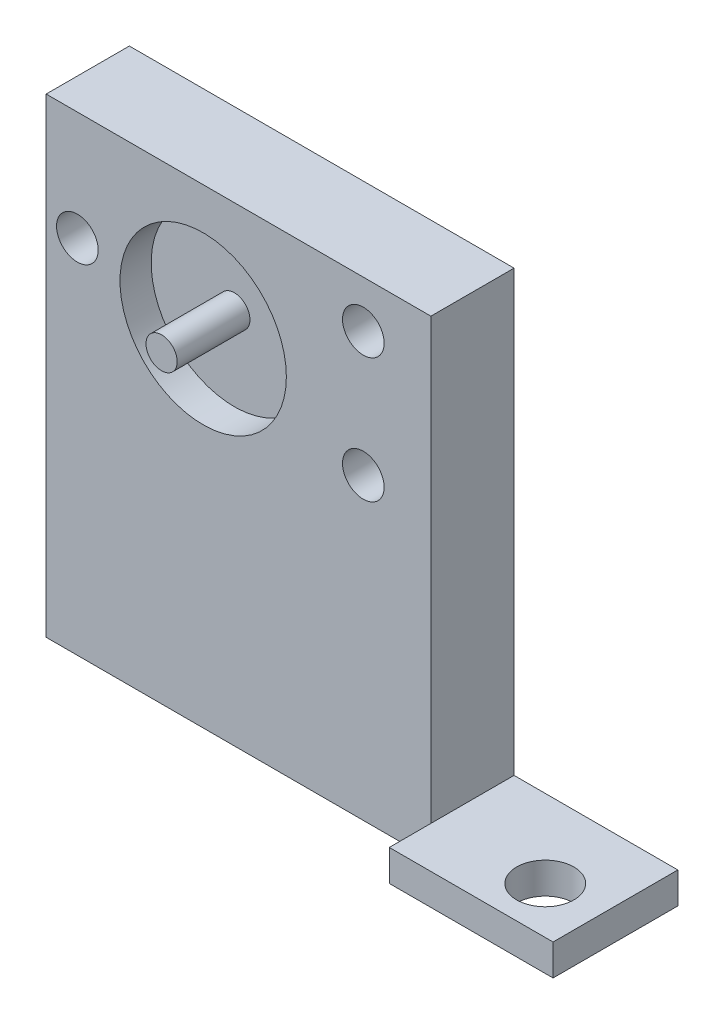
ISO-10303-21;
HEADER;
FILE_DESCRIPTION(('STEP AP214'),'2;1');
FILE_NAME('part.step','',(''),(''),'','','');
FILE_SCHEMA(('AUTOMOTIVE_DESIGN { 1 0 10303 214 1 1 1 1 }'));
ENDSEC;
DATA;
#1=APPLICATION_CONTEXT('core data for automotive mechanical design processes');
#2=APPLICATION_PROTOCOL_DEFINITION('international standard','automotive_design',2000,#1);
#3=PRODUCT_CONTEXT('',#1,'mechanical');
#4=PRODUCT('Part','Part','',(#3));
#5=PRODUCT_RELATED_PRODUCT_CATEGORY('part','',(#4));
#6=PRODUCT_DEFINITION_FORMATION('','',#4);
#7=PRODUCT_DEFINITION_CONTEXT('part definition',#1,'design');
#8=PRODUCT_DEFINITION('design','',#6,#7);
#9=PRODUCT_DEFINITION_SHAPE('','',#8);
#10=(LENGTH_UNIT() NAMED_UNIT(*) SI_UNIT(.MILLI.,.METRE.));
#11=(NAMED_UNIT(*) PLANE_ANGLE_UNIT() SI_UNIT($,.RADIAN.));
#12=(NAMED_UNIT(*) SI_UNIT($,.STERADIAN.) SOLID_ANGLE_UNIT());
#13=UNCERTAINTY_MEASURE_WITH_UNIT(LENGTH_MEASURE(1.E-05),#10,'distance_accuracy_value','');
#14=(GEOMETRIC_REPRESENTATION_CONTEXT(3) GLOBAL_UNCERTAINTY_ASSIGNED_CONTEXT((#13)) GLOBAL_UNIT_ASSIGNED_CONTEXT((#10,
#11,#12)) REPRESENTATION_CONTEXT('',''));
#15=CARTESIAN_POINT('',(0.,0.,0.));
#16=DIRECTION('',(0.,0.,1.));
#17=DIRECTION('',(1.,0.,0.));
#18=AXIS2_PLACEMENT_3D('',#15,#16,#17);
#19=CARTESIAN_POINT('',(0.,21.125,12.));
#20=DIRECTION('',(0.,-1.,0.));
#21=DIRECTION('',(1.,0.,0.));
#22=AXIS2_PLACEMENT_3D('',#19,#20,#21);
#23=PLANE('',#22);
#24=DIRECTION('',(-1.,0.,0.));
#25=VECTOR('',#24,1.);
#26=CARTESIAN_POINT('',(0.,21.125,0.));
#27=LINE('',#26,#25);
#28=CARTESIAN_POINT('',(55.5,21.125,0.));
#29=VERTEX_POINT('',#28);
#30=CARTESIAN_POINT('',(18.5,21.125,0.));
#31=VERTEX_POINT('',#30);
#32=EDGE_CURVE('E13',#29,#31,#27,.T.);
#33=ORIENTED_EDGE('',*,*,#32,.T.);
#34=DIRECTION('',(0.,0.,1.));
#35=VECTOR('',#34,1.);
#36=CARTESIAN_POINT('',(18.5,21.125,14.));
#37=LINE('',#36,#35);
#38=CARTESIAN_POINT('',(18.5,21.125,8.));
#39=VERTEX_POINT('',#38);
#40=EDGE_CURVE('E53',#31,#39,#37,.T.);
#41=ORIENTED_EDGE('',*,*,#40,.T.);
#42=DIRECTION('',(-1.,0.,0.));
#43=VECTOR('',#42,1.);
#44=CARTESIAN_POINT('',(0.,21.125,8.));
#45=LINE('',#44,#43);
#46=CARTESIAN_POINT('',(55.5,21.125,8.));
#47=VERTEX_POINT('',#46);
#48=EDGE_CURVE('E119',#47,#39,#45,.T.);
#49=ORIENTED_EDGE('',*,*,#48,.F.);
#50=DIRECTION('',(0.,0.,-1.));
#51=VECTOR('',#50,1.);
#52=CARTESIAN_POINT('',(55.5,21.125,12.));
#53=LINE('',#52,#51);
#54=EDGE_CURVE('E124',#47,#29,#53,.T.);
#55=ORIENTED_EDGE('',*,*,#54,.T.);
#56=EDGE_LOOP('',(#33,#41,#49,#55));
#57=FACE_BOUND('',#56,.T.);
#58=ADVANCED_FACE('F39',(#57),#23,.F.);
#59=CARTESIAN_POINT('',(0.,-24.125,0.));
#60=DIRECTION('',(0.,-1.,0.));
#61=DIRECTION('',(1.,0.,0.));
#62=AXIS2_PLACEMENT_3D('',#59,#60,#61);
#63=PLANE('',#62);
#64=DIRECTION('',(0.,0.,-1.));
#65=VECTOR('',#64,1.);
#66=CARTESIAN_POINT('',(18.5,-24.125,14.));
#67=LINE('',#66,#65);
#68=CARTESIAN_POINT('',(18.5,-24.125,8.));
#69=VERTEX_POINT('',#68);
#70=CARTESIAN_POINT('',(18.5,-24.125,0.));
#71=VERTEX_POINT('',#70);
#72=EDGE_CURVE('E100',#69,#71,#67,.T.);
#73=ORIENTED_EDGE('',*,*,#72,.T.);
#74=DIRECTION('',(1.,0.,0.));
#75=VECTOR('',#74,1.);
#76=CARTESIAN_POINT('',(0.,-24.125,0.));
#77=LINE('',#76,#75);
#78=CARTESIAN_POINT('',(71.25,-24.125,0.));
#79=VERTEX_POINT('',#78);
#80=EDGE_CURVE('E46',#71,#79,#77,.T.);
#81=ORIENTED_EDGE('',*,*,#80,.T.);
#82=DIRECTION('',(0.,0.,-1.));
#83=VECTOR('',#82,1.);
#84=CARTESIAN_POINT('',(71.25,-24.125,0.));
#85=LINE('',#84,#83);
#86=CARTESIAN_POINT('',(71.25,-24.125,12.));
#87=VERTEX_POINT('',#86);
#88=EDGE_CURVE('E155',#87,#79,#85,.T.);
#89=ORIENTED_EDGE('',*,*,#88,.F.);
#90=DIRECTION('',(1.,0.,0.));
#91=VECTOR('',#90,1.);
#92=CARTESIAN_POINT('',(37.,-24.125,12.));
#93=LINE('',#92,#91);
#94=CARTESIAN_POINT('',(55.5,-24.125,12.));
#95=VERTEX_POINT('',#94);
#96=EDGE_CURVE('E143',#95,#87,#93,.T.);
#97=ORIENTED_EDGE('',*,*,#96,.F.);
#98=DIRECTION('',(0.,0.,1.));
#99=VECTOR('',#98,1.);
#100=CARTESIAN_POINT('',(55.5,-24.125,8.));
#101=LINE('',#100,#99);
#102=CARTESIAN_POINT('',(55.5,-24.125,8.));
#103=VERTEX_POINT('',#102);
#104=EDGE_CURVE('E152',#103,#95,#101,.T.);
#105=ORIENTED_EDGE('',*,*,#104,.F.);
#106=DIRECTION('',(1.,0.,0.));
#107=VECTOR('',#106,1.);
#108=CARTESIAN_POINT('',(0.,-24.125,8.));
#109=LINE('',#108,#107);
#110=EDGE_CURVE('E113',#69,#103,#109,.T.);
#111=ORIENTED_EDGE('',*,*,#110,.F.);
#112=EDGE_LOOP('',(#73,#81,#89,#97,#105,#111));
#113=FACE_BOUND('',#112,.T.);
#114=CARTESIAN_POINT('',(66.,-24.125,7.5));
#115=DIRECTION('',(0.,1.,0.));
#116=DIRECTION('',(-1.,0.,0.));
#117=AXIS2_PLACEMENT_3D('',#114,#115,#116);
#118=CIRCLE('',#117,2.75);
#119=CARTESIAN_POINT('',(63.25,-24.125,7.5));
#120=VERTEX_POINT('',#119);
#121=EDGE_CURVE('E139',#120,#120,#118,.T.);
#122=ORIENTED_EDGE('',*,*,#121,.T.);
#123=EDGE_LOOP('',(#122));
#124=FACE_BOUND('',#123,.T.);
#125=ADVANCED_FACE('F108',(#113,#124),#63,.T.);
#126=CARTESIAN_POINT('',(55.5,0.,12.));
#127=DIRECTION('',(-1.,0.,0.));
#128=DIRECTION('',(0.,-1.,0.));
#129=AXIS2_PLACEMENT_3D('',#126,#127,#128);
#130=PLANE('',#129);
#131=DIRECTION('',(0.,-1.,0.));
#132=VECTOR('',#131,1.);
#133=CARTESIAN_POINT('',(55.5,0.,8.));
#134=LINE('',#133,#132);
#135=CARTESIAN_POINT('',(55.5,-21.125,8.));
#136=VERTEX_POINT('',#135);
#137=EDGE_CURVE('E159',#47,#136,#134,.T.);
#138=ORIENTED_EDGE('',*,*,#137,.T.);
#139=DIRECTION('',(0.,0.,-1.));
#140=VECTOR('',#139,1.);
#141=CARTESIAN_POINT('',(55.5,-21.125,12.));
#142=LINE('',#141,#140);
#143=CARTESIAN_POINT('',(55.5,-21.125,0.));
#144=VERTEX_POINT('',#143);
#145=EDGE_CURVE('E128',#136,#144,#142,.T.);
#146=ORIENTED_EDGE('',*,*,#145,.T.);
#147=DIRECTION('',(0.,1.,0.));
#148=VECTOR('',#147,1.);
#149=CARTESIAN_POINT('',(55.5,0.,0.));
#150=LINE('',#149,#148);
#151=EDGE_CURVE('E129',#144,#29,#150,.T.);
#152=ORIENTED_EDGE('',*,*,#151,.T.);
#153=ORIENTED_EDGE('',*,*,#54,.F.);
#154=EDGE_LOOP('',(#138,#146,#152,#153));
#155=FACE_BOUND('',#154,.T.);
#156=ADVANCED_FACE('F203',(#155),#130,.F.);
#157=CARTESIAN_POINT('',(37.,0.,12.));
#158=DIRECTION('',(0.,0.,1.));
#159=DIRECTION('',(-1.,0.,0.));
#160=AXIS2_PLACEMENT_3D('',#157,#158,#159);
#161=PLANE('',#160);
#162=DIRECTION('',(1.,0.,0.));
#163=VECTOR('',#162,1.);
#164=CARTESIAN_POINT('',(37.,-21.125,12.));
#165=LINE('',#164,#163);
#166=CARTESIAN_POINT('',(55.5,-21.125,12.));
#167=VERTEX_POINT('',#166);
#168=CARTESIAN_POINT('',(71.25,-21.125,12.));
#169=VERTEX_POINT('',#168);
#170=EDGE_CURVE('E150',#167,#169,#165,.T.);
#171=ORIENTED_EDGE('',*,*,#170,.F.);
#172=DIRECTION('',(0.,-1.,0.));
#173=VECTOR('',#172,1.);
#174=CARTESIAN_POINT('',(55.5,0.,12.));
#175=LINE('',#174,#173);
#176=EDGE_CURVE('E62',#167,#95,#175,.T.);
#177=ORIENTED_EDGE('',*,*,#176,.T.);
#178=ORIENTED_EDGE('',*,*,#96,.T.);
#179=DIRECTION('',(0.,1.,0.));
#180=VECTOR('',#179,1.);
#181=CARTESIAN_POINT('',(71.25,-24.125,12.));
#182=LINE('',#181,#180);
#183=EDGE_CURVE('E136',#87,#169,#182,.T.);
#184=ORIENTED_EDGE('',*,*,#183,.T.);
#185=EDGE_LOOP('',(#171,#177,#178,#184));
#186=FACE_BOUND('',#185,.T.);
#187=ADVANCED_FACE('F214',(#186),#161,.T.);
#188=CARTESIAN_POINT('',(0.,0.,8.));
#189=DIRECTION('',(0.,0.,1.));
#190=DIRECTION('',(1.,0.,0.));
#191=AXIS2_PLACEMENT_3D('',#188,#189,#190);
#192=PLANE('',#191);
#193=DIRECTION('',(0.,1.,0.));
#194=VECTOR('',#193,1.);
#195=CARTESIAN_POINT('',(18.5,0.,8.));
#196=LINE('',#195,#194);
#197=EDGE_CURVE('E178',#69,#39,#196,.T.);
#198=ORIENTED_EDGE('',*,*,#197,.F.);
#199=ORIENTED_EDGE('',*,*,#110,.T.);
#200=EDGE_CURVE('E161',#136,#103,#134,.T.);
#201=ORIENTED_EDGE('',*,*,#200,.F.);
#202=ORIENTED_EDGE('',*,*,#137,.F.);
#203=ORIENTED_EDGE('',*,*,#48,.T.);
#204=EDGE_LOOP('',(#198,#199,#201,#202,#203));
#205=FACE_BOUND('',#204,.T.);
#206=CARTESIAN_POINT('',(49.,16.625,8.));
#207=DIRECTION('',(0.,0.,-1.));
#208=DIRECTION('',(-1.,0.,0.));
#209=AXIS2_PLACEMENT_3D('',#206,#207,#208);
#210=CIRCLE('',#209,2.);
#211=CARTESIAN_POINT('',(47.,16.625,8.));
#212=VERTEX_POINT('',#211);
#213=EDGE_CURVE('E187',#212,#212,#210,.T.);
#214=ORIENTED_EDGE('',*,*,#213,.T.);
#215=EDGE_LOOP('',(#214));
#216=FACE_BOUND('',#215,.T.);
#217=CARTESIAN_POINT('',(49.,4.625,8.));
#218=DIRECTION('',(0.,0.,-1.));
#219=DIRECTION('',(-1.,0.,0.));
#220=AXIS2_PLACEMENT_3D('',#217,#218,#219);
#221=CIRCLE('',#220,2.);
#222=CARTESIAN_POINT('',(47.,4.625,8.));
#223=VERTEX_POINT('',#222);
#224=EDGE_CURVE('E181',#223,#223,#221,.T.);
#225=ORIENTED_EDGE('',*,*,#224,.T.);
#226=EDGE_LOOP('',(#225));
#227=FACE_BOUND('',#226,.T.);
#228=CARTESIAN_POINT('',(21.5,10.625,8.));
#229=DIRECTION('',(0.,0.,-1.));
#230=DIRECTION('',(-1.,0.,0.));
#231=AXIS2_PLACEMENT_3D('',#228,#229,#230);
#232=CIRCLE('',#231,2.);
#233=CARTESIAN_POINT('',(19.5,10.625,8.));
#234=VERTEX_POINT('',#233);
#235=EDGE_CURVE('E174',#234,#234,#232,.T.);
#236=ORIENTED_EDGE('',*,*,#235,.T.);
#237=EDGE_LOOP('',(#236));
#238=FACE_BOUND('',#237,.T.);
#239=CARTESIAN_POINT('',(33.6,9.125,8.));
#240=DIRECTION('',(0.,0.,1.));
#241=DIRECTION('',(1.,0.,0.));
#242=AXIS2_PLACEMENT_3D('',#239,#240,#241);
#243=CIRCLE('',#242,8.);
#244=CARTESIAN_POINT('',(41.6,9.125,8.));
#245=VERTEX_POINT('',#244);
#246=EDGE_CURVE('E162',#245,#245,#243,.F.);
#247=ORIENTED_EDGE('',*,*,#246,.T.);
#248=EDGE_LOOP('',(#247));
#249=FACE_BOUND('',#248,.T.);
#250=ADVANCED_FACE('F196',(#205,#216,#227,#238,#249),#192,.T.);
#251=CARTESIAN_POINT('',(0.,0.,0.));
#252=DIRECTION('',(0.,0.,1.));
#253=DIRECTION('',(1.,0.,0.));
#254=AXIS2_PLACEMENT_3D('',#251,#252,#253);
#255=PLANE('',#254);
#256=CARTESIAN_POINT('',(49.,16.625,0.));
#257=DIRECTION('',(0.,0.,-1.));
#258=DIRECTION('',(-1.,0.,0.));
#259=AXIS2_PLACEMENT_3D('',#256,#257,#258);
#260=CIRCLE('',#259,2.);
#261=CARTESIAN_POINT('',(47.,16.625,0.));
#262=VERTEX_POINT('',#261);
#263=EDGE_CURVE('E173',#262,#262,#260,.T.);
#264=ORIENTED_EDGE('',*,*,#263,.F.);
#265=EDGE_LOOP('',(#264));
#266=FACE_BOUND('',#265,.T.);
#267=CARTESIAN_POINT('',(49.,4.625,0.));
#268=DIRECTION('',(0.,0.,-1.));
#269=DIRECTION('',(-1.,0.,0.));
#270=AXIS2_PLACEMENT_3D('',#267,#268,#269);
#271=CIRCLE('',#270,2.);
#272=CARTESIAN_POINT('',(47.,4.625,0.));
#273=VERTEX_POINT('',#272);
#274=EDGE_CURVE('E184',#273,#273,#271,.T.);
#275=ORIENTED_EDGE('',*,*,#274,.F.);
#276=EDGE_LOOP('',(#275));
#277=FACE_BOUND('',#276,.T.);
#278=CARTESIAN_POINT('',(21.5,10.625,0.));
#279=DIRECTION('',(0.,0.,-1.));
#280=DIRECTION('',(-1.,0.,0.));
#281=AXIS2_PLACEMENT_3D('',#278,#279,#280);
#282=CIRCLE('',#281,2.);
#283=CARTESIAN_POINT('',(19.5,10.625,0.));
#284=VERTEX_POINT('',#283);
#285=EDGE_CURVE('E177',#284,#284,#282,.T.);
#286=ORIENTED_EDGE('',*,*,#285,.F.);
#287=EDGE_LOOP('',(#286));
#288=FACE_BOUND('',#287,.T.);
#289=ORIENTED_EDGE('',*,*,#80,.F.);
#290=DIRECTION('',(0.,1.,0.));
#291=VECTOR('',#290,1.);
#292=CARTESIAN_POINT('',(18.5,21.125,0.));
#293=LINE('',#292,#291);
#294=EDGE_CURVE('E97',#71,#31,#293,.T.);
#295=ORIENTED_EDGE('',*,*,#294,.T.);
#296=ORIENTED_EDGE('',*,*,#32,.F.);
#297=ORIENTED_EDGE('',*,*,#151,.F.);
#298=DIRECTION('',(-1.,0.,0.));
#299=VECTOR('',#298,1.);
#300=CARTESIAN_POINT('',(37.,-21.125,0.));
#301=LINE('',#300,#299);
#302=CARTESIAN_POINT('',(71.25,-21.125,0.));
#303=VERTEX_POINT('',#302);
#304=EDGE_CURVE('E147',#303,#144,#301,.T.);
#305=ORIENTED_EDGE('',*,*,#304,.F.);
#306=DIRECTION('',(0.,1.,0.));
#307=VECTOR('',#306,1.);
#308=CARTESIAN_POINT('',(71.25,-24.125,0.));
#309=LINE('',#308,#307);
#310=EDGE_CURVE('E117',#79,#303,#309,.T.);
#311=ORIENTED_EDGE('',*,*,#310,.F.);
#312=EDGE_LOOP('',(#289,#295,#296,#297,#305,#311));
#313=FACE_BOUND('',#312,.T.);
#314=ADVANCED_FACE('F115',(#266,#277,#288,#313),#255,.F.);
#315=CARTESIAN_POINT('',(37.,-21.125,0.));
#316=DIRECTION('',(0.,-1.,0.));
#317=DIRECTION('',(-1.,0.,0.));
#318=AXIS2_PLACEMENT_3D('',#315,#316,#317);
#319=PLANE('',#318);
#320=CARTESIAN_POINT('',(66.,-21.125,7.5));
#321=DIRECTION('',(0.,1.,0.));
#322=DIRECTION('',(-1.,0.,0.));
#323=AXIS2_PLACEMENT_3D('',#320,#321,#322);
#324=CIRCLE('',#323,2.75);
#325=CARTESIAN_POINT('',(63.25,-21.125,7.5));
#326=VERTEX_POINT('',#325);
#327=EDGE_CURVE('E140',#326,#326,#324,.T.);
#328=ORIENTED_EDGE('',*,*,#327,.F.);
#329=EDGE_LOOP('',(#328));
#330=FACE_BOUND('',#329,.T.);
#331=ORIENTED_EDGE('',*,*,#304,.T.);
#332=ORIENTED_EDGE('',*,*,#145,.F.);
#333=EDGE_CURVE('E126',#167,#136,#142,.T.);
#334=ORIENTED_EDGE('',*,*,#333,.F.);
#335=ORIENTED_EDGE('',*,*,#170,.T.);
#336=DIRECTION('',(0.,0.,-1.));
#337=VECTOR('',#336,1.);
#338=CARTESIAN_POINT('',(71.25,-21.125,0.));
#339=LINE('',#338,#337);
#340=EDGE_CURVE('E144',#169,#303,#339,.T.);
#341=ORIENTED_EDGE('',*,*,#340,.T.);
#342=EDGE_LOOP('',(#331,#332,#334,#335,#341));
#343=FACE_BOUND('',#342,.T.);
#344=ADVANCED_FACE('F207',(#330,#343),#319,.F.);
#345=CARTESIAN_POINT('',(71.25,-24.125,0.));
#346=DIRECTION('',(1.,0.,0.));
#347=DIRECTION('',(0.,1.,0.));
#348=AXIS2_PLACEMENT_3D('',#345,#346,#347);
#349=PLANE('',#348);
#350=ORIENTED_EDGE('',*,*,#340,.F.);
#351=ORIENTED_EDGE('',*,*,#183,.F.);
#352=ORIENTED_EDGE('',*,*,#88,.T.);
#353=ORIENTED_EDGE('',*,*,#310,.T.);
#354=EDGE_LOOP('',(#350,#351,#352,#353));
#355=FACE_BOUND('',#354,.T.);
#356=ADVANCED_FACE('F211',(#355),#349,.T.);
#357=CARTESIAN_POINT('',(66.,-24.125,7.5));
#358=DIRECTION('',(0.,1.,0.));
#359=DIRECTION('',(-1.,0.,0.));
#360=AXIS2_PLACEMENT_3D('',#357,#358,#359);
#361=CYLINDRICAL_SURFACE('',#360,2.75);
#362=ORIENTED_EDGE('',*,*,#121,.F.);
#363=EDGE_LOOP('',(#362));
#364=FACE_BOUND('',#363,.T.);
#365=ORIENTED_EDGE('',*,*,#327,.T.);
#366=EDGE_LOOP('',(#365));
#367=FACE_BOUND('',#366,.T.);
#368=ADVANCED_FACE('F218',(#364,#367),#361,.F.);
#369=CARTESIAN_POINT('',(55.5,0.,8.));
#370=DIRECTION('',(-1.,0.,0.));
#371=DIRECTION('',(0.,-1.,0.));
#372=AXIS2_PLACEMENT_3D('',#369,#370,#371);
#373=PLANE('',#372);
#374=ORIENTED_EDGE('',*,*,#333,.T.);
#375=ORIENTED_EDGE('',*,*,#200,.T.);
#376=ORIENTED_EDGE('',*,*,#104,.T.);
#377=ORIENTED_EDGE('',*,*,#176,.F.);
#378=EDGE_LOOP('',(#374,#375,#376,#377));
#379=FACE_BOUND('',#378,.T.);
#380=ADVANCED_FACE('F215',(#379),#373,.T.);
#381=CARTESIAN_POINT('',(33.6,9.125,-20.6274169979695));
#382=DIRECTION('',(0.,0.,1.));
#383=DIRECTION('',(1.,0.,0.));
#384=AXIS2_PLACEMENT_3D('',#381,#382,#383);
#385=CYLINDRICAL_SURFACE('',#384,8.);
#386=ORIENTED_EDGE('',*,*,#246,.F.);
#387=EDGE_LOOP('',(#386));
#388=FACE_BOUND('',#387,.T.);
#389=CARTESIAN_POINT('',(33.6,9.125,5.));
#390=DIRECTION('',(0.,0.,1.));
#391=DIRECTION('',(1.,0.,0.));
#392=AXIS2_PLACEMENT_3D('',#389,#390,#391);
#393=CIRCLE('',#392,8.);
#394=CARTESIAN_POINT('',(41.6,9.125,5.));
#395=VERTEX_POINT('',#394);
#396=EDGE_CURVE('E167',#395,#395,#393,.T.);
#397=ORIENTED_EDGE('',*,*,#396,.F.);
#398=EDGE_LOOP('',(#397));
#399=FACE_BOUND('',#398,.T.);
#400=ADVANCED_FACE('F217',(#388,#399),#385,.F.);
#401=CARTESIAN_POINT('',(0.,0.,5.));
#402=DIRECTION('',(0.,0.,1.));
#403=DIRECTION('',(1.,0.,0.));
#404=AXIS2_PLACEMENT_3D('',#401,#402,#403);
#405=PLANE('',#404);
#406=CARTESIAN_POINT('',(33.6,9.125,5.));
#407=DIRECTION('',(0.,0.,1.));
#408=DIRECTION('',(1.,0.,0.));
#409=AXIS2_PLACEMENT_3D('',#406,#407,#408);
#410=CIRCLE('',#409,1.50000000000001);
#411=CARTESIAN_POINT('',(35.1,9.125,5.));
#412=VERTEX_POINT('',#411);
#413=EDGE_CURVE('E170',#412,#412,#410,.T.);
#414=ORIENTED_EDGE('',*,*,#413,.F.);
#415=EDGE_LOOP('',(#414));
#416=FACE_BOUND('',#415,.T.);
#417=ORIENTED_EDGE('',*,*,#396,.T.);
#418=EDGE_LOOP('',(#417));
#419=FACE_BOUND('',#418,.T.);
#420=ADVANCED_FACE('F224',(#416,#419),#405,.T.);
#421=CARTESIAN_POINT('',(33.6,9.125,12.));
#422=DIRECTION('',(0.,0.,-1.));
#423=DIRECTION('',(-1.,0.,0.));
#424=AXIS2_PLACEMENT_3D('',#421,#422,#423);
#425=CIRCLE('',#424,1.50000000000001);
#426=CARTESIAN_POINT('',(32.1,9.125,12.));
#427=VERTEX_POINT('',#426);
#428=EDGE_CURVE('E132',#427,#427,#425,.T.);
#429=ORIENTED_EDGE('',*,*,#428,.F.);
#430=EDGE_LOOP('',(#429));
#431=FACE_BOUND('',#430,.T.);
#432=ADVANCED_FACE('F267',(#431),#161,.T.);
#433=CARTESIAN_POINT('',(33.6,9.125,-10.9705627484772));
#434=DIRECTION('',(0.,0.,1.));
#435=DIRECTION('',(1.,0.,0.));
#436=AXIS2_PLACEMENT_3D('',#433,#434,#435);
#437=CYLINDRICAL_SURFACE('',#436,1.50000000000001);
#438=ORIENTED_EDGE('',*,*,#428,.T.);
#439=EDGE_LOOP('',(#438));
#440=FACE_BOUND('',#439,.T.);
#441=ORIENTED_EDGE('',*,*,#413,.T.);
#442=EDGE_LOOP('',(#441));
#443=FACE_BOUND('',#442,.T.);
#444=ADVANCED_FACE('F257',(#440,#443),#437,.T.);
#445=CARTESIAN_POINT('',(21.5,10.625,0.));
#446=DIRECTION('',(0.,0.,1.));
#447=DIRECTION('',(1.,0.,0.));
#448=AXIS2_PLACEMENT_3D('',#445,#446,#447);
#449=CYLINDRICAL_SURFACE('',#448,2.);
#450=ORIENTED_EDGE('',*,*,#285,.T.);
#451=EDGE_LOOP('',(#450));
#452=FACE_BOUND('',#451,.T.);
#453=ORIENTED_EDGE('',*,*,#235,.F.);
#454=EDGE_LOOP('',(#453));
#455=FACE_BOUND('',#454,.T.);
#456=ADVANCED_FACE('F253',(#452,#455),#449,.F.);
#457=CARTESIAN_POINT('',(49.,4.625,0.));
#458=DIRECTION('',(0.,0.,1.));
#459=DIRECTION('',(1.,0.,0.));
#460=AXIS2_PLACEMENT_3D('',#457,#458,#459);
#461=CYLINDRICAL_SURFACE('',#460,2.);
#462=ORIENTED_EDGE('',*,*,#274,.T.);
#463=EDGE_LOOP('',(#462));
#464=FACE_BOUND('',#463,.T.);
#465=ORIENTED_EDGE('',*,*,#224,.F.);
#466=EDGE_LOOP('',(#465));
#467=FACE_BOUND('',#466,.T.);
#468=ADVANCED_FACE('F256',(#464,#467),#461,.F.);
#469=CARTESIAN_POINT('',(49.,16.625,0.));
#470=DIRECTION('',(0.,0.,1.));
#471=DIRECTION('',(1.,0.,0.));
#472=AXIS2_PLACEMENT_3D('',#469,#470,#471);
#473=CYLINDRICAL_SURFACE('',#472,2.);
#474=ORIENTED_EDGE('',*,*,#263,.T.);
#475=EDGE_LOOP('',(#474));
#476=FACE_BOUND('',#475,.T.);
#477=ORIENTED_EDGE('',*,*,#213,.F.);
#478=EDGE_LOOP('',(#477));
#479=FACE_BOUND('',#478,.T.);
#480=ADVANCED_FACE('F279',(#476,#479),#473,.F.);
#481=CARTESIAN_POINT('',(18.5,0.,0.));
#482=DIRECTION('',(1.,0.,0.));
#483=DIRECTION('',(0.,0.,-1.));
#484=AXIS2_PLACEMENT_3D('',#481,#482,#483);
#485=PLANE('',#484);
#486=ORIENTED_EDGE('',*,*,#197,.T.);
#487=ORIENTED_EDGE('',*,*,#40,.F.);
#488=ORIENTED_EDGE('',*,*,#294,.F.);
#489=ORIENTED_EDGE('',*,*,#72,.F.);
#490=EDGE_LOOP('',(#486,#487,#488,#489));
#491=FACE_BOUND('',#490,.T.);
#492=ADVANCED_FACE('F99',(#491),#485,.F.);
#493=CLOSED_SHELL('',(#58,#125,#156,#187,#250,#314,#344,#356,#368,#380,#400,#420,#432,#444,#456,
#468,#480,#492));
#494=MANIFOLD_SOLID_BREP('B2',#493);
#495=ADVANCED_BREP_SHAPE_REPRESENTATION('',(#18,#494),#14);
#496=SHAPE_DEFINITION_REPRESENTATION(#9,#495);
ENDSEC;
END-ISO-10303-21;
